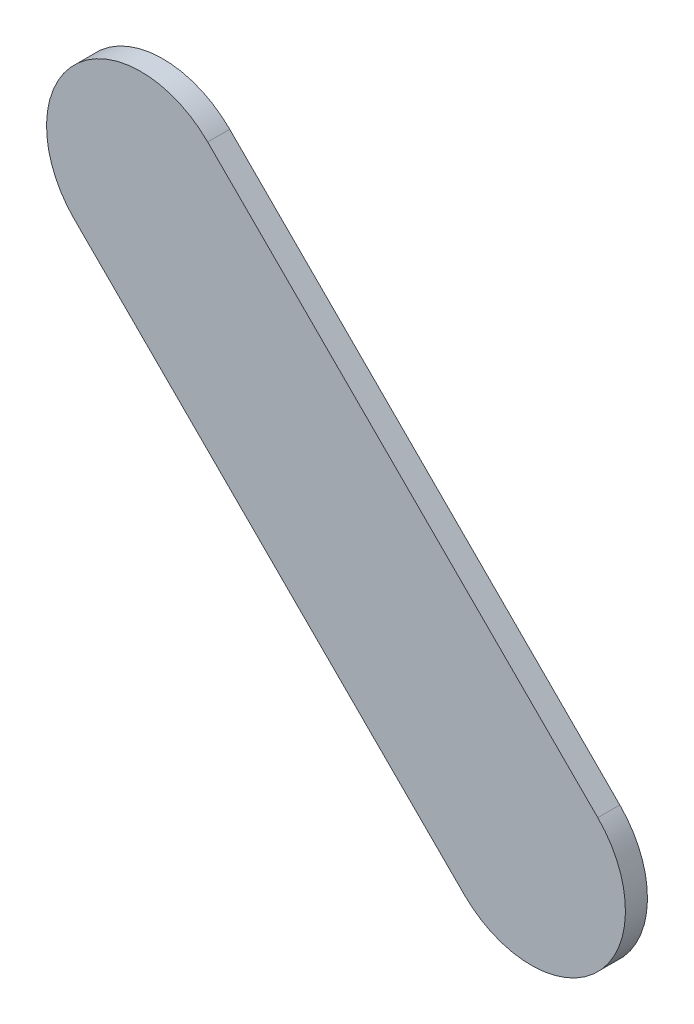
ISO-10303-21;
HEADER;
FILE_DESCRIPTION(('STEP AP214'),'2;1');
FILE_NAME('part.step','',(''),(''),'','','');
FILE_SCHEMA(('AUTOMOTIVE_DESIGN { 1 0 10303 214 1 1 1 1 }'));
ENDSEC;
DATA;
#1=APPLICATION_CONTEXT('core data for automotive mechanical design processes');
#2=APPLICATION_PROTOCOL_DEFINITION('international standard','automotive_design',2000,#1);
#3=PRODUCT_CONTEXT('',#1,'mechanical');
#4=PRODUCT('Part','Part','',(#3));
#5=PRODUCT_RELATED_PRODUCT_CATEGORY('part','',(#4));
#6=PRODUCT_DEFINITION_FORMATION('','',#4);
#7=PRODUCT_DEFINITION_CONTEXT('part definition',#1,'design');
#8=PRODUCT_DEFINITION('design','',#6,#7);
#9=PRODUCT_DEFINITION_SHAPE('','',#8);
#10=(LENGTH_UNIT() NAMED_UNIT(*) SI_UNIT(.MILLI.,.METRE.));
#11=(NAMED_UNIT(*) PLANE_ANGLE_UNIT() SI_UNIT($,.RADIAN.));
#12=(NAMED_UNIT(*) SI_UNIT($,.STERADIAN.) SOLID_ANGLE_UNIT());
#13=UNCERTAINTY_MEASURE_WITH_UNIT(LENGTH_MEASURE(1.E-05),#10,'distance_accuracy_value','');
#14=(GEOMETRIC_REPRESENTATION_CONTEXT(3) GLOBAL_UNCERTAINTY_ASSIGNED_CONTEXT((#13)) GLOBAL_UNIT_ASSIGNED_CONTEXT((#10,
#11,#12)) REPRESENTATION_CONTEXT('',''));
#15=CARTESIAN_POINT('',(0.,0.,0.));
#16=DIRECTION('',(0.,0.,1.));
#17=DIRECTION('',(1.,0.,0.));
#18=AXIS2_PLACEMENT_3D('',#15,#16,#17);
#19=CARTESIAN_POINT('',(129.893933,-70.816066,1.635));
#20=DIRECTION('',(0.,0.,1.));
#21=DIRECTION('',(1.,0.,0.));
#22=AXIS2_PLACEMENT_3D('',#19,#20,#21);
#23=PLANE('',#22);
#24=DIRECTION('',(0.707106781186548,-0.707106781186548,0.));
#25=VECTOR('',#24,1.);
#26=CARTESIAN_POINT('',(129.893933,-70.816066,1.635));
#27=LINE('',#26,#25);
#28=CARTESIAN_POINT('',(129.893933,-70.816066,1.635));
#29=VERTEX_POINT('',#28);
#30=CARTESIAN_POINT('',(130.513933,-71.436066,1.635));
#31=VERTEX_POINT('',#30);
#32=EDGE_CURVE('E81',#29,#31,#27,.T.);
#33=ORIENTED_EDGE('',*,*,#32,.T.);
#34=CARTESIAN_POINT('',(130.6199995,-71.3299995,1.635));
#35=DIRECTION('',(0.,0.,1.));
#36=DIRECTION('',(-0.707106781186548,-0.707106781186548,0.));
#37=AXIS2_PLACEMENT_3D('',#34,#35,#36);
#38=CIRCLE('',#37,0.150000682813);
#39=CARTESIAN_POINT('',(130.726066,-71.223933,1.635));
#40=VERTEX_POINT('',#39);
#41=EDGE_CURVE('E98',#31,#40,#38,.T.);
#42=ORIENTED_EDGE('',*,*,#41,.T.);
#43=DIRECTION('',(-0.707106781186548,0.707106781186548,0.));
#44=VECTOR('',#43,1.);
#45=CARTESIAN_POINT('',(130.726066,-71.223933,1.635));
#46=LINE('',#45,#44);
#47=CARTESIAN_POINT('',(130.106066,-70.603933,1.635));
#48=VERTEX_POINT('',#47);
#49=EDGE_CURVE('E74',#40,#48,#46,.T.);
#50=ORIENTED_EDGE('',*,*,#49,.T.);
#51=CARTESIAN_POINT('',(129.9999995,-70.7099995,1.635));
#52=DIRECTION('',(0.,0.,1.));
#53=DIRECTION('',(0.707106781186548,0.707106781186548,0.));
#54=AXIS2_PLACEMENT_3D('',#51,#52,#53);
#55=CIRCLE('',#54,0.150000682813);
#56=EDGE_CURVE('E11',#48,#29,#55,.T.);
#57=ORIENTED_EDGE('',*,*,#56,.T.);
#58=EDGE_LOOP('',(#33,#42,#50,#57));
#59=FACE_BOUND('',#58,.T.);
#60=ADVANCED_FACE('F17',(#59),#23,.T.);
#61=CARTESIAN_POINT('',(129.893933,-70.816066,1.6));
#62=DIRECTION('',(0.,0.,1.));
#63=DIRECTION('',(1.,0.,0.));
#64=AXIS2_PLACEMENT_3D('',#61,#62,#63);
#65=PLANE('',#64);
#66=CARTESIAN_POINT('',(129.9999995,-70.7099995,1.6));
#67=DIRECTION('',(0.,0.,1.));
#68=DIRECTION('',(0.707106781186548,0.707106781186548,0.));
#69=AXIS2_PLACEMENT_3D('',#66,#67,#68);
#70=CIRCLE('',#69,0.150000682813);
#71=CARTESIAN_POINT('',(130.106066,-70.603933,1.6));
#72=VERTEX_POINT('',#71);
#73=CARTESIAN_POINT('',(129.893933,-70.816066,1.6));
#74=VERTEX_POINT('',#73);
#75=EDGE_CURVE('E25',#72,#74,#70,.T.);
#76=ORIENTED_EDGE('',*,*,#75,.F.);
#77=DIRECTION('',(-0.707106781186548,0.707106781186548,0.));
#78=VECTOR('',#77,1.);
#79=CARTESIAN_POINT('',(130.726066,-71.223933,1.6));
#80=LINE('',#79,#78);
#81=CARTESIAN_POINT('',(130.726066,-71.223933,1.6));
#82=VERTEX_POINT('',#81);
#83=EDGE_CURVE('E109',#82,#72,#80,.T.);
#84=ORIENTED_EDGE('',*,*,#83,.F.);
#85=CARTESIAN_POINT('',(130.6199995,-71.3299995,1.6));
#86=DIRECTION('',(0.,0.,1.));
#87=DIRECTION('',(-0.707106781186548,-0.707106781186548,0.));
#88=AXIS2_PLACEMENT_3D('',#85,#86,#87);
#89=CIRCLE('',#88,0.150000682813);
#90=CARTESIAN_POINT('',(130.513933,-71.436066,1.6));
#91=VERTEX_POINT('',#90);
#92=EDGE_CURVE('E83',#91,#82,#89,.T.);
#93=ORIENTED_EDGE('',*,*,#92,.F.);
#94=DIRECTION('',(0.707106781186548,-0.707106781186548,0.));
#95=VECTOR('',#94,1.);
#96=CARTESIAN_POINT('',(129.893933,-70.816066,1.6));
#97=LINE('',#96,#95);
#98=EDGE_CURVE('E79',#74,#91,#97,.T.);
#99=ORIENTED_EDGE('',*,*,#98,.F.);
#100=EDGE_LOOP('',(#76,#84,#93,#99));
#101=FACE_BOUND('',#100,.T.);
#102=ADVANCED_FACE('F85',(#101),#65,.F.);
#103=CARTESIAN_POINT('',(129.9999995,-70.7099995,1.6));
#104=DIRECTION('',(0.,0.,-1.));
#105=DIRECTION('',(0.707106781186548,0.707106781186548,0.));
#106=AXIS2_PLACEMENT_3D('',#103,#104,#105);
#107=CYLINDRICAL_SURFACE('',#106,0.150000682813);
#108=ORIENTED_EDGE('',*,*,#75,.T.);
#109=DIRECTION('',(0.,0.,1.));
#110=VECTOR('',#109,1.);
#111=CARTESIAN_POINT('',(129.893933,-70.816066,1.6));
#112=LINE('',#111,#110);
#113=EDGE_CURVE('E68',#74,#29,#112,.T.);
#114=ORIENTED_EDGE('',*,*,#113,.T.);
#115=ORIENTED_EDGE('',*,*,#56,.F.);
#116=DIRECTION('',(0.,0.,1.));
#117=VECTOR('',#116,1.);
#118=CARTESIAN_POINT('',(130.106066,-70.603933,1.6));
#119=LINE('',#118,#117);
#120=EDGE_CURVE('E71',#72,#48,#119,.T.);
#121=ORIENTED_EDGE('',*,*,#120,.F.);
#122=EDGE_LOOP('',(#108,#114,#115,#121));
#123=FACE_BOUND('',#122,.T.);
#124=ADVANCED_FACE('F67',(#123),#107,.T.);
#125=CARTESIAN_POINT('',(130.726066,-71.223933,1.6));
#126=DIRECTION('',(-0.707106781186548,-0.707106781186548,0.));
#127=DIRECTION('',(-0.707106781186548,0.707106781186548,0.));
#128=AXIS2_PLACEMENT_3D('',#125,#126,#127);
#129=PLANE('',#128);
#130=ORIENTED_EDGE('',*,*,#83,.T.);
#131=ORIENTED_EDGE('',*,*,#120,.T.);
#132=ORIENTED_EDGE('',*,*,#49,.F.);
#133=DIRECTION('',(0.,0.,1.));
#134=VECTOR('',#133,1.);
#135=CARTESIAN_POINT('',(130.726066,-71.223933,1.6));
#136=LINE('',#135,#134);
#137=EDGE_CURVE('E99',#82,#40,#136,.T.);
#138=ORIENTED_EDGE('',*,*,#137,.F.);
#139=EDGE_LOOP('',(#130,#131,#132,#138));
#140=FACE_BOUND('',#139,.T.);
#141=ADVANCED_FACE('F116',(#140),#129,.F.);
#142=CARTESIAN_POINT('',(130.6199995,-71.3299995,1.6));
#143=DIRECTION('',(0.,0.,-1.));
#144=DIRECTION('',(-0.707106781186548,-0.707106781186548,0.));
#145=AXIS2_PLACEMENT_3D('',#142,#143,#144);
#146=CYLINDRICAL_SURFACE('',#145,0.150000682813);
#147=ORIENTED_EDGE('',*,*,#92,.T.);
#148=ORIENTED_EDGE('',*,*,#137,.T.);
#149=ORIENTED_EDGE('',*,*,#41,.F.);
#150=DIRECTION('',(0.,0.,1.));
#151=VECTOR('',#150,1.);
#152=CARTESIAN_POINT('',(130.513933,-71.436066,1.6));
#153=LINE('',#152,#151);
#154=EDGE_CURVE('E89',#91,#31,#153,.T.);
#155=ORIENTED_EDGE('',*,*,#154,.F.);
#156=EDGE_LOOP('',(#147,#148,#149,#155));
#157=FACE_BOUND('',#156,.T.);
#158=ADVANCED_FACE('F120',(#157),#146,.T.);
#159=CARTESIAN_POINT('',(129.893933,-70.816066,1.6));
#160=DIRECTION('',(0.707106781186548,0.707106781186548,0.));
#161=DIRECTION('',(0.,0.,-1.));
#162=AXIS2_PLACEMENT_3D('',#159,#160,#161);
#163=PLANE('',#162);
#164=ORIENTED_EDGE('',*,*,#98,.T.);
#165=ORIENTED_EDGE('',*,*,#154,.T.);
#166=ORIENTED_EDGE('',*,*,#32,.F.);
#167=ORIENTED_EDGE('',*,*,#113,.F.);
#168=EDGE_LOOP('',(#164,#165,#166,#167));
#169=FACE_BOUND('',#168,.T.);
#170=ADVANCED_FACE('F77',(#169),#163,.F.);
#171=CLOSED_SHELL('',(#60,#102,#124,#141,#158,#170));
#172=MANIFOLD_SOLID_BREP('B1',#171);
#173=ADVANCED_BREP_SHAPE_REPRESENTATION('',(#18,#172),#14);
#174=SHAPE_DEFINITION_REPRESENTATION(#9,#173);
ENDSEC;
END-ISO-10303-21;
